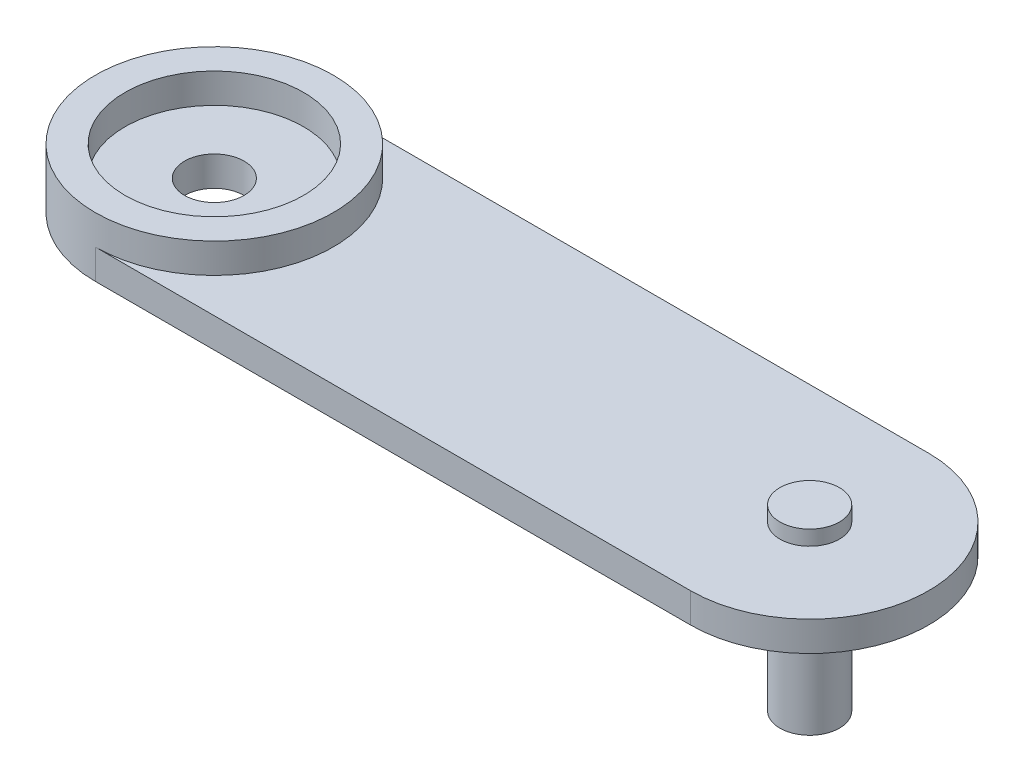
ISO-10303-21;
HEADER;
FILE_DESCRIPTION(('STEP AP214'),'2;1');
FILE_NAME('part.step','',(''),(''),'','','');
FILE_SCHEMA(('AUTOMOTIVE_DESIGN { 1 0 10303 214 1 1 1 1 }'));
ENDSEC;
DATA;
#1=APPLICATION_CONTEXT('core data for automotive mechanical design processes');
#2=APPLICATION_PROTOCOL_DEFINITION('international standard','automotive_design',2000,#1);
#3=PRODUCT_CONTEXT('',#1,'mechanical');
#4=PRODUCT('Part','Part','',(#3));
#5=PRODUCT_RELATED_PRODUCT_CATEGORY('part','',(#4));
#6=PRODUCT_DEFINITION_FORMATION('','',#4);
#7=PRODUCT_DEFINITION_CONTEXT('part definition',#1,'design');
#8=PRODUCT_DEFINITION('design','',#6,#7);
#9=PRODUCT_DEFINITION_SHAPE('','',#8);
#10=(LENGTH_UNIT() NAMED_UNIT(*) SI_UNIT(.MILLI.,.METRE.));
#11=(NAMED_UNIT(*) PLANE_ANGLE_UNIT() SI_UNIT($,.RADIAN.));
#12=(NAMED_UNIT(*) SI_UNIT($,.STERADIAN.) SOLID_ANGLE_UNIT());
#13=UNCERTAINTY_MEASURE_WITH_UNIT(LENGTH_MEASURE(1.E-05),#10,'distance_accuracy_value','');
#14=(GEOMETRIC_REPRESENTATION_CONTEXT(3) GLOBAL_UNCERTAINTY_ASSIGNED_CONTEXT((#13)) GLOBAL_UNIT_ASSIGNED_CONTEXT((#10,
#11,#12)) REPRESENTATION_CONTEXT('',''));
#15=CARTESIAN_POINT('',(0.,0.,0.));
#16=DIRECTION('',(0.,0.,1.));
#17=DIRECTION('',(1.,0.,0.));
#18=AXIS2_PLACEMENT_3D('',#15,#16,#17);
#19=CARTESIAN_POINT('',(-200.,10.,0.));
#20=DIRECTION('',(0.,-1.,0.));
#21=DIRECTION('',(0.,0.,-1.));
#22=AXIS2_PLACEMENT_3D('',#19,#20,#21);
#23=CYLINDRICAL_SURFACE('',#22,40.);
#24=CARTESIAN_POINT('',(-200.,0.,0.));
#25=DIRECTION('',(0.,1.,0.));
#26=DIRECTION('',(0.,0.,1.));
#27=AXIS2_PLACEMENT_3D('',#24,#25,#26);
#28=CIRCLE('',#27,40.);
#29=CARTESIAN_POINT('',(-200.,0.,-40.));
#30=VERTEX_POINT('',#29);
#31=CARTESIAN_POINT('',(-200.,0.,40.));
#32=VERTEX_POINT('',#31);
#33=EDGE_CURVE('E100',#30,#32,#28,.T.);
#34=ORIENTED_EDGE('',*,*,#33,.T.);
#35=DIRECTION('',(0.,-1.,0.));
#36=VECTOR('',#35,1.);
#37=CARTESIAN_POINT('',(-200.,10.,40.));
#38=LINE('',#37,#36);
#39=CARTESIAN_POINT('',(-200.,10.,40.));
#40=VERTEX_POINT('',#39);
#41=EDGE_CURVE('E53',#40,#32,#38,.T.);
#42=ORIENTED_EDGE('',*,*,#41,.F.);
#43=CARTESIAN_POINT('',(-200.,10.,0.));
#44=DIRECTION('',(0.,1.,0.));
#45=DIRECTION('',(0.,0.,1.));
#46=AXIS2_PLACEMENT_3D('',#43,#44,#45);
#47=CIRCLE('',#46,40.);
#48=CARTESIAN_POINT('',(-200.,10.,-40.));
#49=VERTEX_POINT('',#48);
#50=EDGE_CURVE('E98',#40,#49,#47,.T.);
#51=ORIENTED_EDGE('',*,*,#50,.T.);
#52=DIRECTION('',(0.,-1.,0.));
#53=VECTOR('',#52,1.);
#54=CARTESIAN_POINT('',(-200.,10.,-40.));
#55=LINE('',#54,#53);
#56=EDGE_CURVE('E127',#49,#30,#55,.T.);
#57=ORIENTED_EDGE('',*,*,#56,.T.);
#58=EDGE_LOOP('',(#34,#42,#51,#57));
#59=FACE_BOUND('',#58,.T.);
#60=CARTESIAN_POINT('',(-200.,20.,0.));
#61=DIRECTION('',(0.,1.,0.));
#62=DIRECTION('',(0.,0.,1.));
#63=AXIS2_PLACEMENT_3D('',#60,#61,#62);
#64=CIRCLE('',#63,40.);
#65=CARTESIAN_POINT('',(-200.,20.,40.));
#66=VERTEX_POINT('',#65);
#67=EDGE_CURVE('E111',#66,#66,#64,.T.);
#68=ORIENTED_EDGE('',*,*,#67,.F.);
#69=EDGE_LOOP('',(#68));
#70=FACE_BOUND('',#69,.T.);
#71=ADVANCED_FACE('F43',(#59,#70),#23,.T.);
#72=CARTESIAN_POINT('',(-200.,10.,40.));
#73=DIRECTION('',(0.,0.,-1.));
#74=DIRECTION('',(-1.,0.,0.));
#75=AXIS2_PLACEMENT_3D('',#72,#73,#74);
#76=PLANE('',#75);
#77=DIRECTION('',(1.,0.,0.));
#78=VECTOR('',#77,1.);
#79=CARTESIAN_POINT('',(-200.,0.,40.));
#80=LINE('',#79,#78);
#81=CARTESIAN_POINT('',(0.,0.,40.));
#82=VERTEX_POINT('',#81);
#83=EDGE_CURVE('E130',#32,#82,#80,.T.);
#84=ORIENTED_EDGE('',*,*,#83,.T.);
#85=DIRECTION('',(0.,-1.,0.));
#86=VECTOR('',#85,1.);
#87=CARTESIAN_POINT('',(0.,10.,40.));
#88=LINE('',#87,#86);
#89=CARTESIAN_POINT('',(0.,10.,40.));
#90=VERTEX_POINT('',#89);
#91=EDGE_CURVE('E103',#90,#82,#88,.T.);
#92=ORIENTED_EDGE('',*,*,#91,.F.);
#93=DIRECTION('',(1.,0.,0.));
#94=VECTOR('',#93,1.);
#95=CARTESIAN_POINT('',(-200.,10.,40.));
#96=LINE('',#95,#94);
#97=EDGE_CURVE('E89',#40,#90,#96,.T.);
#98=ORIENTED_EDGE('',*,*,#97,.F.);
#99=ORIENTED_EDGE('',*,*,#41,.T.);
#100=EDGE_LOOP('',(#84,#92,#98,#99));
#101=FACE_BOUND('',#100,.T.);
#102=ADVANCED_FACE('F104',(#101),#76,.F.);
#103=CARTESIAN_POINT('',(0.,10.,0.));
#104=DIRECTION('',(0.,-1.,0.));
#105=DIRECTION('',(0.,0.,-1.));
#106=AXIS2_PLACEMENT_3D('',#103,#104,#105);
#107=CYLINDRICAL_SURFACE('',#106,40.);
#108=CARTESIAN_POINT('',(0.,0.,0.));
#109=DIRECTION('',(0.,1.,0.));
#110=DIRECTION('',(0.,0.,1.));
#111=AXIS2_PLACEMENT_3D('',#108,#109,#110);
#112=CIRCLE('',#111,40.);
#113=CARTESIAN_POINT('',(0.,0.,-40.));
#114=VERTEX_POINT('',#113);
#115=EDGE_CURVE('E80',#82,#114,#112,.T.);
#116=ORIENTED_EDGE('',*,*,#115,.T.);
#117=DIRECTION('',(0.,-1.,0.));
#118=VECTOR('',#117,1.);
#119=CARTESIAN_POINT('',(0.,10.,-40.));
#120=LINE('',#119,#118);
#121=CARTESIAN_POINT('',(0.,10.,-40.));
#122=VERTEX_POINT('',#121);
#123=EDGE_CURVE('E139',#122,#114,#120,.T.);
#124=ORIENTED_EDGE('',*,*,#123,.F.);
#125=CARTESIAN_POINT('',(0.,10.,0.));
#126=DIRECTION('',(0.,1.,0.));
#127=DIRECTION('',(0.,0.,1.));
#128=AXIS2_PLACEMENT_3D('',#125,#126,#127);
#129=CIRCLE('',#128,40.);
#130=EDGE_CURVE('E107',#90,#122,#129,.T.);
#131=ORIENTED_EDGE('',*,*,#130,.F.);
#132=ORIENTED_EDGE('',*,*,#91,.T.);
#133=EDGE_LOOP('',(#116,#124,#131,#132));
#134=FACE_BOUND('',#133,.T.);
#135=ADVANCED_FACE('F143',(#134),#107,.T.);
#136=CARTESIAN_POINT('',(-200.,10.,-40.));
#137=DIRECTION('',(0.,0.,1.));
#138=DIRECTION('',(1.,0.,0.));
#139=AXIS2_PLACEMENT_3D('',#136,#137,#138);
#140=PLANE('',#139);
#141=DIRECTION('',(-1.,0.,0.));
#142=VECTOR('',#141,1.);
#143=CARTESIAN_POINT('',(-200.,0.,-40.));
#144=LINE('',#143,#142);
#145=EDGE_CURVE('E85',#114,#30,#144,.T.);
#146=ORIENTED_EDGE('',*,*,#145,.T.);
#147=ORIENTED_EDGE('',*,*,#56,.F.);
#148=DIRECTION('',(-1.,0.,0.));
#149=VECTOR('',#148,1.);
#150=CARTESIAN_POINT('',(-200.,10.,-40.));
#151=LINE('',#150,#149);
#152=EDGE_CURVE('E62',#122,#49,#151,.T.);
#153=ORIENTED_EDGE('',*,*,#152,.F.);
#154=ORIENTED_EDGE('',*,*,#123,.T.);
#155=EDGE_LOOP('',(#146,#147,#153,#154));
#156=FACE_BOUND('',#155,.T.);
#157=ADVANCED_FACE('F157',(#156),#140,.F.);
#158=CARTESIAN_POINT('',(-200.,10.,0.));
#159=DIRECTION('',(0.,1.,0.));
#160=DIRECTION('',(0.,0.,1.));
#161=AXIS2_PLACEMENT_3D('',#158,#159,#160);
#162=PLANE('',#161);
#163=CARTESIAN_POINT('',(0.,10.,0.));
#164=DIRECTION('',(0.,1.,0.));
#165=DIRECTION('',(0.,0.,1.));
#166=AXIS2_PLACEMENT_3D('',#163,#164,#165);
#167=CIRCLE('',#166,10.);
#168=CARTESIAN_POINT('',(0.,10.,10.));
#169=VERTEX_POINT('',#168);
#170=EDGE_CURVE('E11',#169,#169,#167,.T.);
#171=ORIENTED_EDGE('',*,*,#170,.F.);
#172=EDGE_LOOP('',(#171));
#173=FACE_BOUND('',#172,.T.);
#174=ORIENTED_EDGE('',*,*,#50,.F.);
#175=ORIENTED_EDGE('',*,*,#97,.T.);
#176=ORIENTED_EDGE('',*,*,#130,.T.);
#177=ORIENTED_EDGE('',*,*,#152,.T.);
#178=EDGE_LOOP('',(#174,#175,#176,#177));
#179=FACE_BOUND('',#178,.T.);
#180=ADVANCED_FACE('F109',(#173,#179),#162,.T.);
#181=CARTESIAN_POINT('',(-200.,0.,0.));
#182=DIRECTION('',(0.,1.,0.));
#183=DIRECTION('',(0.,0.,1.));
#184=AXIS2_PLACEMENT_3D('',#181,#182,#183);
#185=PLANE('',#184);
#186=CARTESIAN_POINT('',(0.,0.,0.));
#187=DIRECTION('',(0.,1.,0.));
#188=DIRECTION('',(0.,0.,1.));
#189=AXIS2_PLACEMENT_3D('',#186,#187,#188);
#190=CIRCLE('',#189,10.);
#191=CARTESIAN_POINT('',(0.,0.,10.));
#192=VERTEX_POINT('',#191);
#193=EDGE_CURVE('E46',#192,#192,#190,.T.);
#194=ORIENTED_EDGE('',*,*,#193,.T.);
#195=EDGE_LOOP('',(#194));
#196=FACE_BOUND('',#195,.T.);
#197=CARTESIAN_POINT('',(-200.,0.,0.));
#198=DIRECTION('',(0.,1.,0.));
#199=DIRECTION('',(0.,0.,1.));
#200=AXIS2_PLACEMENT_3D('',#197,#198,#199);
#201=CIRCLE('',#200,10.);
#202=CARTESIAN_POINT('',(-200.,0.,10.));
#203=VERTEX_POINT('',#202);
#204=EDGE_CURVE('E312',#203,#203,#201,.T.);
#205=ORIENTED_EDGE('',*,*,#204,.T.);
#206=EDGE_LOOP('',(#205));
#207=FACE_BOUND('',#206,.T.);
#208=ORIENTED_EDGE('',*,*,#33,.F.);
#209=ORIENTED_EDGE('',*,*,#145,.F.);
#210=ORIENTED_EDGE('',*,*,#115,.F.);
#211=ORIENTED_EDGE('',*,*,#83,.F.);
#212=EDGE_LOOP('',(#208,#209,#210,#211));
#213=FACE_BOUND('',#212,.T.);
#214=ADVANCED_FACE('F145',(#196,#207,#213),#185,.F.);
#215=CARTESIAN_POINT('',(-200.,20.,0.));
#216=DIRECTION('',(0.,1.,0.));
#217=DIRECTION('',(0.,0.,1.));
#218=AXIS2_PLACEMENT_3D('',#215,#216,#217);
#219=PLANE('',#218);
#220=CARTESIAN_POINT('',(-200.,20.,0.));
#221=DIRECTION('',(0.,1.,0.));
#222=DIRECTION('',(0.,0.,1.));
#223=AXIS2_PLACEMENT_3D('',#220,#221,#222);
#224=CIRCLE('',#223,30.);
#225=CARTESIAN_POINT('',(-200.,20.,30.));
#226=VERTEX_POINT('',#225);
#227=EDGE_CURVE('E119',#226,#226,#224,.T.);
#228=ORIENTED_EDGE('',*,*,#227,.F.);
#229=EDGE_LOOP('',(#228));
#230=FACE_BOUND('',#229,.T.);
#231=ORIENTED_EDGE('',*,*,#67,.T.);
#232=EDGE_LOOP('',(#231));
#233=FACE_BOUND('',#232,.T.);
#234=ADVANCED_FACE('F147',(#230,#233),#219,.T.);
#235=CARTESIAN_POINT('',(-200.,10.,0.));
#236=DIRECTION('',(0.,1.,0.));
#237=DIRECTION('',(0.,0.,1.));
#238=AXIS2_PLACEMENT_3D('',#235,#236,#237);
#239=CYLINDRICAL_SURFACE('',#238,30.);
#240=CARTESIAN_POINT('',(-200.,10.,0.));
#241=DIRECTION('',(0.,1.,0.));
#242=DIRECTION('',(0.,0.,1.));
#243=AXIS2_PLACEMENT_3D('',#240,#241,#242);
#244=CIRCLE('',#243,30.);
#245=CARTESIAN_POINT('',(-200.,10.,30.));
#246=VERTEX_POINT('',#245);
#247=EDGE_CURVE('E112',#246,#246,#244,.T.);
#248=ORIENTED_EDGE('',*,*,#247,.F.);
#249=EDGE_LOOP('',(#248));
#250=FACE_BOUND('',#249,.T.);
#251=ORIENTED_EDGE('',*,*,#227,.T.);
#252=EDGE_LOOP('',(#251));
#253=FACE_BOUND('',#252,.T.);
#254=ADVANCED_FACE('F154',(#250,#253),#239,.F.);
#255=CARTESIAN_POINT('',(-200.,10.,0.));
#256=DIRECTION('',(0.,1.,0.));
#257=DIRECTION('',(0.,0.,1.));
#258=AXIS2_PLACEMENT_3D('',#255,#256,#257);
#259=PLANE('',#258);
#260=CARTESIAN_POINT('',(-200.,10.,0.));
#261=DIRECTION('',(0.,1.,0.));
#262=DIRECTION('',(0.,0.,1.));
#263=AXIS2_PLACEMENT_3D('',#260,#261,#262);
#264=CIRCLE('',#263,10.);
#265=CARTESIAN_POINT('',(-200.,10.,10.));
#266=VERTEX_POINT('',#265);
#267=EDGE_CURVE('E315',#266,#266,#264,.T.);
#268=ORIENTED_EDGE('',*,*,#267,.F.);
#269=EDGE_LOOP('',(#268));
#270=FACE_BOUND('',#269,.T.);
#271=ORIENTED_EDGE('',*,*,#247,.T.);
#272=EDGE_LOOP('',(#271));
#273=FACE_BOUND('',#272,.T.);
#274=ADVANCED_FACE('F248',(#270,#273),#259,.T.);
#275=CARTESIAN_POINT('',(-200.,0.,0.));
#276=DIRECTION('',(0.,1.,0.));
#277=DIRECTION('',(0.,0.,1.));
#278=AXIS2_PLACEMENT_3D('',#275,#276,#277);
#279=CYLINDRICAL_SURFACE('',#278,10.);
#280=ORIENTED_EDGE('',*,*,#204,.F.);
#281=EDGE_LOOP('',(#280));
#282=FACE_BOUND('',#281,.T.);
#283=ORIENTED_EDGE('',*,*,#267,.T.);
#284=EDGE_LOOP('',(#283));
#285=FACE_BOUND('',#284,.T.);
#286=ADVANCED_FACE('F188',(#282,#285),#279,.F.);
#287=CARTESIAN_POINT('',(0.,-45.,0.));
#288=DIRECTION('',(0.,1.,0.));
#289=DIRECTION('',(0.,0.,1.));
#290=AXIS2_PLACEMENT_3D('',#287,#288,#289);
#291=PLANE('',#290);
#292=CARTESIAN_POINT('',(0.,-45.,0.));
#293=DIRECTION('',(0.,1.,0.));
#294=DIRECTION('',(0.,0.,1.));
#295=AXIS2_PLACEMENT_3D('',#292,#293,#294);
#296=CIRCLE('',#295,10.);
#297=CARTESIAN_POINT('',(0.,-45.,10.));
#298=VERTEX_POINT('',#297);
#299=EDGE_CURVE('E321',#298,#298,#296,.T.);
#300=ORIENTED_EDGE('',*,*,#299,.F.);
#301=EDGE_LOOP('',(#300));
#302=FACE_BOUND('',#301,.T.);
#303=ADVANCED_FACE('F199',(#302),#291,.F.);
#304=CARTESIAN_POINT('',(0.,-45.,0.));
#305=DIRECTION('',(0.,1.,0.));
#306=DIRECTION('',(0.,0.,1.));
#307=AXIS2_PLACEMENT_3D('',#304,#305,#306);
#308=CYLINDRICAL_SURFACE('',#307,10.);
#309=ORIENTED_EDGE('',*,*,#299,.T.);
#310=EDGE_LOOP('',(#309));
#311=FACE_BOUND('',#310,.T.);
#312=ORIENTED_EDGE('',*,*,#193,.F.);
#313=EDGE_LOOP('',(#312));
#314=FACE_BOUND('',#313,.T.);
#315=ADVANCED_FACE('F204',(#311,#314),#308,.T.);
#316=ORIENTED_EDGE('',*,*,#170,.T.);
#317=EDGE_LOOP('',(#316));
#318=FACE_BOUND('',#317,.T.);
#319=CARTESIAN_POINT('',(0.,15.,0.));
#320=DIRECTION('',(0.,1.,0.));
#321=DIRECTION('',(0.,0.,1.));
#322=AXIS2_PLACEMENT_3D('',#319,#320,#321);
#323=CIRCLE('',#322,10.);
#324=CARTESIAN_POINT('',(0.,15.,10.));
#325=VERTEX_POINT('',#324);
#326=EDGE_CURVE('E325',#325,#325,#323,.T.);
#327=ORIENTED_EDGE('',*,*,#326,.F.);
#328=EDGE_LOOP('',(#327));
#329=FACE_BOUND('',#328,.T.);
#330=ADVANCED_FACE('F215',(#318,#329),#308,.T.);
#331=CARTESIAN_POINT('',(0.,15.,0.));
#332=DIRECTION('',(0.,1.,0.));
#333=DIRECTION('',(0.,0.,1.));
#334=AXIS2_PLACEMENT_3D('',#331,#332,#333);
#335=PLANE('',#334);
#336=ORIENTED_EDGE('',*,*,#326,.T.);
#337=EDGE_LOOP('',(#336));
#338=FACE_BOUND('',#337,.T.);
#339=ADVANCED_FACE('F226',(#338),#335,.T.);
#340=CLOSED_SHELL('',(#71,#102,#135,#157,#180,#214,#234,#254,#274,#286,#303,#315,#330,#339));
#341=MANIFOLD_SOLID_BREP('B2',#340);
#342=ADVANCED_BREP_SHAPE_REPRESENTATION('',(#18,#341),#14);
#343=SHAPE_DEFINITION_REPRESENTATION(#9,#342);
ENDSEC;
END-ISO-10303-21;
